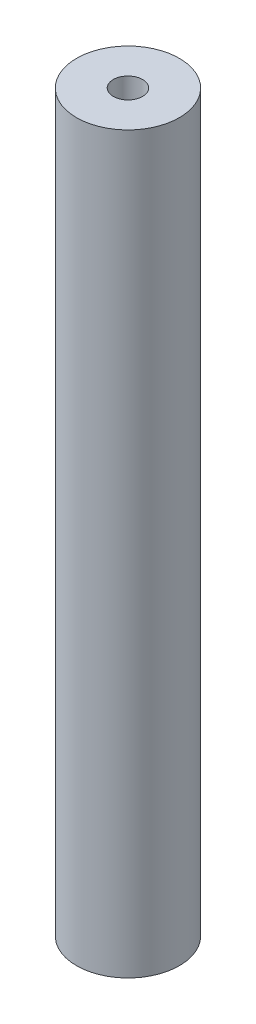
ISO-10303-21;
HEADER;
FILE_DESCRIPTION(('STEP AP214'),'2;1');
FILE_NAME('part.step','',(''),(''),'','','');
FILE_SCHEMA(('AUTOMOTIVE_DESIGN { 1 0 10303 214 1 1 1 1 }'));
ENDSEC;
DATA;
#1=APPLICATION_CONTEXT('core data for automotive mechanical design processes');
#2=APPLICATION_PROTOCOL_DEFINITION('international standard','automotive_design',2000,#1);
#3=PRODUCT_CONTEXT('',#1,'mechanical');
#4=PRODUCT('Part','Part','',(#3));
#5=PRODUCT_RELATED_PRODUCT_CATEGORY('part','',(#4));
#6=PRODUCT_DEFINITION_FORMATION('','',#4);
#7=PRODUCT_DEFINITION_CONTEXT('part definition',#1,'design');
#8=PRODUCT_DEFINITION('design','',#6,#7);
#9=PRODUCT_DEFINITION_SHAPE('','',#8);
#10=(LENGTH_UNIT() NAMED_UNIT(*) SI_UNIT(.MILLI.,.METRE.));
#11=(NAMED_UNIT(*) PLANE_ANGLE_UNIT() SI_UNIT($,.RADIAN.));
#12=(NAMED_UNIT(*) SI_UNIT($,.STERADIAN.) SOLID_ANGLE_UNIT());
#13=UNCERTAINTY_MEASURE_WITH_UNIT(LENGTH_MEASURE(1.E-05),#10,'distance_accuracy_value','');
#14=(GEOMETRIC_REPRESENTATION_CONTEXT(3) GLOBAL_UNCERTAINTY_ASSIGNED_CONTEXT((#13)) GLOBAL_UNIT_ASSIGNED_CONTEXT((#10,
#11,#12)) REPRESENTATION_CONTEXT('',''));
#15=CARTESIAN_POINT('',(0.,0.,0.));
#16=DIRECTION('',(0.,0.,1.));
#17=DIRECTION('',(1.,0.,0.));
#18=AXIS2_PLACEMENT_3D('',#15,#16,#17);
#19=CARTESIAN_POINT('',(0.,125.,0.));
#20=DIRECTION('',(0.,-1.,0.));
#21=DIRECTION('',(0.,0.,-1.));
#22=AXIS2_PLACEMENT_3D('',#19,#20,#21);
#23=CYLINDRICAL_SURFACE('',#22,8.75);
#24=CARTESIAN_POINT('',(0.,125.,0.));
#25=DIRECTION('',(0.,1.,0.));
#26=DIRECTION('',(0.,0.,1.));
#27=AXIS2_PLACEMENT_3D('',#24,#25,#26);
#28=CIRCLE('',#27,8.75);
#29=CARTESIAN_POINT('',(0.,125.,8.75));
#30=VERTEX_POINT('',#29);
#31=EDGE_CURVE('E10',#30,#30,#28,.T.);
#32=ORIENTED_EDGE('',*,*,#31,.F.);
#33=EDGE_LOOP('',(#32));
#34=FACE_BOUND('',#33,.T.);
#35=CARTESIAN_POINT('',(0.,0.,0.));
#36=DIRECTION('',(0.,1.,0.));
#37=DIRECTION('',(0.,0.,1.));
#38=AXIS2_PLACEMENT_3D('',#35,#36,#37);
#39=CIRCLE('',#38,8.75);
#40=CARTESIAN_POINT('',(0.,0.,8.75));
#41=VERTEX_POINT('',#40);
#42=EDGE_CURVE('E35',#41,#41,#39,.T.);
#43=ORIENTED_EDGE('',*,*,#42,.T.);
#44=EDGE_LOOP('',(#43));
#45=FACE_BOUND('',#44,.T.);
#46=ADVANCED_FACE('F32',(#34,#45),#23,.T.);
#47=CARTESIAN_POINT('',(0.,125.,0.));
#48=DIRECTION('',(0.,1.,0.));
#49=DIRECTION('',(0.,0.,1.));
#50=AXIS2_PLACEMENT_3D('',#47,#48,#49);
#51=PLANE('',#50);
#52=CARTESIAN_POINT('',(0.,125.,0.));
#53=DIRECTION('',(0.,1.,0.));
#54=DIRECTION('',(0.,0.,1.));
#55=AXIS2_PLACEMENT_3D('',#52,#53,#54);
#56=CIRCLE('',#55,2.5);
#57=CARTESIAN_POINT('',(0.,125.,2.5));
#58=VERTEX_POINT('',#57);
#59=EDGE_CURVE('E42',#58,#58,#56,.F.);
#60=ORIENTED_EDGE('',*,*,#59,.T.);
#61=EDGE_LOOP('',(#60));
#62=FACE_BOUND('',#61,.T.);
#63=ORIENTED_EDGE('',*,*,#31,.T.);
#64=EDGE_LOOP('',(#63));
#65=FACE_BOUND('',#64,.T.);
#66=ADVANCED_FACE('F60',(#62,#65),#51,.T.);
#67=CARTESIAN_POINT('',(0.,0.,0.));
#68=DIRECTION('',(0.,1.,0.));
#69=DIRECTION('',(0.,0.,1.));
#70=AXIS2_PLACEMENT_3D('',#67,#68,#69);
#71=PLANE('',#70);
#72=CARTESIAN_POINT('',(0.,0.,0.));
#73=DIRECTION('',(0.,1.,0.));
#74=DIRECTION('',(0.,0.,1.));
#75=AXIS2_PLACEMENT_3D('',#72,#73,#74);
#76=CIRCLE('',#75,2.5);
#77=CARTESIAN_POINT('',(0.,0.,2.5));
#78=VERTEX_POINT('',#77);
#79=EDGE_CURVE('E46',#78,#78,#76,.T.);
#80=ORIENTED_EDGE('',*,*,#79,.T.);
#81=EDGE_LOOP('',(#80));
#82=FACE_BOUND('',#81,.T.);
#83=ORIENTED_EDGE('',*,*,#42,.F.);
#84=EDGE_LOOP('',(#83));
#85=FACE_BOUND('',#84,.T.);
#86=ADVANCED_FACE('F50',(#82,#85),#71,.F.);
#87=CARTESIAN_POINT('',(0.,131.,0.));
#88=DIRECTION('',(0.,-1.,0.));
#89=DIRECTION('',(0.,0.,-1.));
#90=AXIS2_PLACEMENT_3D('',#87,#88,#89);
#91=CYLINDRICAL_SURFACE('',#90,2.5);
#92=ORIENTED_EDGE('',*,*,#59,.F.);
#93=EDGE_LOOP('',(#92));
#94=FACE_BOUND('',#93,.T.);
#95=ORIENTED_EDGE('',*,*,#79,.F.);
#96=EDGE_LOOP('',(#95));
#97=FACE_BOUND('',#96,.T.);
#98=ADVANCED_FACE('F53',(#94,#97),#91,.F.);
#99=CLOSED_SHELL('',(#46,#66,#86,#98));
#100=MANIFOLD_SOLID_BREP('B2',#99);
#101=ADVANCED_BREP_SHAPE_REPRESENTATION('',(#18,#100),#14);
#102=SHAPE_DEFINITION_REPRESENTATION(#9,#101);
ENDSEC;
END-ISO-10303-21;
